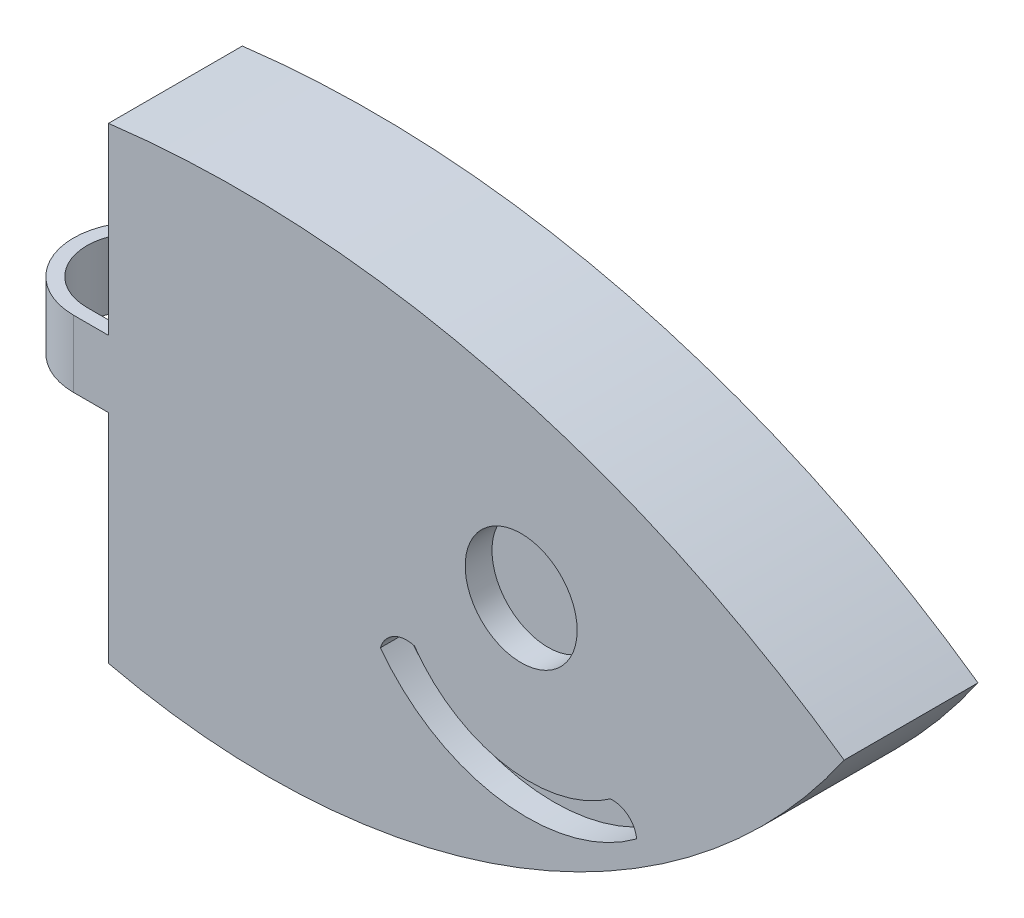
ISO-10303-21;
HEADER;
FILE_DESCRIPTION(('STEP AP214'),'2;1');
FILE_NAME('part.step','',(''),(''),'','','');
FILE_SCHEMA(('AUTOMOTIVE_DESIGN { 1 0 10303 214 1 1 1 1 }'));
ENDSEC;
DATA;
#1=APPLICATION_CONTEXT('core data for automotive mechanical design processes');
#2=APPLICATION_PROTOCOL_DEFINITION('international standard','automotive_design',2000,#1);
#3=PRODUCT_CONTEXT('',#1,'mechanical');
#4=PRODUCT('Part','Part','',(#3));
#5=PRODUCT_RELATED_PRODUCT_CATEGORY('part','',(#4));
#6=PRODUCT_DEFINITION_FORMATION('','',#4);
#7=PRODUCT_DEFINITION_CONTEXT('part definition',#1,'design');
#8=PRODUCT_DEFINITION('design','',#6,#7);
#9=PRODUCT_DEFINITION_SHAPE('','',#8);
#10=(LENGTH_UNIT() NAMED_UNIT(*) SI_UNIT(.MILLI.,.METRE.));
#11=(NAMED_UNIT(*) PLANE_ANGLE_UNIT() SI_UNIT($,.RADIAN.));
#12=(NAMED_UNIT(*) SI_UNIT($,.STERADIAN.) SOLID_ANGLE_UNIT());
#13=UNCERTAINTY_MEASURE_WITH_UNIT(LENGTH_MEASURE(1.E-05),#10,'distance_accuracy_value','');
#14=(GEOMETRIC_REPRESENTATION_CONTEXT(3) GLOBAL_UNCERTAINTY_ASSIGNED_CONTEXT((#13)) GLOBAL_UNIT_ASSIGNED_CONTEXT((#10,
#11,#12)) REPRESENTATION_CONTEXT('',''));
#15=CARTESIAN_POINT('',(0.,0.,0.));
#16=DIRECTION('',(0.,0.,1.));
#17=DIRECTION('',(1.,0.,0.));
#18=AXIS2_PLACEMENT_3D('',#15,#16,#17);
#19=CARTESIAN_POINT('',(-43.0700554600255,29.7516169908367,10.));
#20=DIRECTION('',(0.,0.,-1.));
#21=DIRECTION('',(-1.,0.,0.));
#22=AXIS2_PLACEMENT_3D('',#19,#20,#21);
#23=CYLINDRICAL_SURFACE('',#22,52.3468087938426);
#24=CARTESIAN_POINT('',(-43.0700554600255,29.7516169908367,0.));
#25=DIRECTION('',(0.,0.,-1.));
#26=DIRECTION('',(-1.,0.,0.));
#27=AXIS2_PLACEMENT_3D('',#24,#25,#26);
#28=CIRCLE('',#27,52.3468087938426);
#29=CARTESIAN_POINT('',(0.,0.,0.));
#30=VERTEX_POINT('',#29);
#31=CARTESIAN_POINT('',(-54.9695237739627,-21.2247603298863,0.));
#32=VERTEX_POINT('',#31);
#33=EDGE_CURVE('E233',#30,#32,#28,.T.);
#34=ORIENTED_EDGE('',*,*,#33,.F.);
#35=DIRECTION('',(0.,0.,-1.));
#36=VECTOR('',#35,1.);
#37=CARTESIAN_POINT('',(0.,0.,10.));
#38=LINE('',#37,#36);
#39=CARTESIAN_POINT('',(0.,0.,10.));
#40=VERTEX_POINT('',#39);
#41=EDGE_CURVE('E11',#40,#30,#38,.T.);
#42=ORIENTED_EDGE('',*,*,#41,.F.);
#43=CARTESIAN_POINT('',(-43.0700554600255,29.7516169908367,10.));
#44=DIRECTION('',(0.,0.,-1.));
#45=DIRECTION('',(-1.,0.,0.));
#46=AXIS2_PLACEMENT_3D('',#43,#44,#45);
#47=CIRCLE('',#46,52.3468087938426);
#48=CARTESIAN_POINT('',(-54.9695237739627,-21.2247603298863,10.));
#49=VERTEX_POINT('',#48);
#50=EDGE_CURVE('E236',#40,#49,#47,.T.);
#51=ORIENTED_EDGE('',*,*,#50,.T.);
#52=DIRECTION('',(0.,0.,-1.));
#53=VECTOR('',#52,1.);
#54=CARTESIAN_POINT('',(-54.9695237739627,-21.2247603298863,10.));
#55=LINE('',#54,#53);
#56=EDGE_CURVE('E36',#49,#32,#55,.T.);
#57=ORIENTED_EDGE('',*,*,#56,.T.);
#58=EDGE_LOOP('',(#34,#42,#51,#57));
#59=FACE_BOUND('',#58,.T.);
#60=ADVANCED_FACE('F33',(#59),#23,.T.);
#61=CARTESIAN_POINT('',(-45.2089541250586,-64.1570790860686,10.));
#62=DIRECTION('',(0.,0.,-1.));
#63=DIRECTION('',(-1.,0.,0.));
#64=AXIS2_PLACEMENT_3D('',#61,#62,#63);
#65=CYLINDRICAL_SURFACE('',#64,78.4855421713943);
#66=CARTESIAN_POINT('',(-45.2089541250586,-64.1570790860686,0.));
#67=DIRECTION('',(0.,0.,1.));
#68=DIRECTION('',(1.,0.,0.));
#69=AXIS2_PLACEMENT_3D('',#66,#67,#68);
#70=CIRCLE('',#69,78.4855421713943);
#71=CARTESIAN_POINT('',(-54.9695237739627,13.719179234851,0.));
#72=VERTEX_POINT('',#71);
#73=EDGE_CURVE('E240',#30,#72,#70,.T.);
#74=ORIENTED_EDGE('',*,*,#73,.T.);
#75=DIRECTION('',(0.,0.,-1.));
#76=VECTOR('',#75,1.);
#77=CARTESIAN_POINT('',(-54.9695237739627,13.719179234851,10.));
#78=LINE('',#77,#76);
#79=CARTESIAN_POINT('',(-54.9695237739627,13.719179234851,10.));
#80=VERTEX_POINT('',#79);
#81=EDGE_CURVE('E41',#80,#72,#78,.T.);
#82=ORIENTED_EDGE('',*,*,#81,.F.);
#83=CARTESIAN_POINT('',(-45.2089541250586,-64.1570790860686,10.));
#84=DIRECTION('',(0.,0.,1.));
#85=DIRECTION('',(1.,0.,0.));
#86=AXIS2_PLACEMENT_3D('',#83,#84,#85);
#87=CIRCLE('',#86,78.4855421713943);
#88=EDGE_CURVE('E244',#40,#80,#87,.T.);
#89=ORIENTED_EDGE('',*,*,#88,.F.);
#90=ORIENTED_EDGE('',*,*,#41,.T.);
#91=EDGE_LOOP('',(#74,#82,#89,#90));
#92=FACE_BOUND('',#91,.T.);
#93=ADVANCED_FACE('F268',(#92),#65,.T.);
#94=CARTESIAN_POINT('',(-54.9695237739627,13.719179234851,10.));
#95=DIRECTION('',(1.,0.,0.));
#96=DIRECTION('',(0.,0.,-1.));
#97=AXIS2_PLACEMENT_3D('',#94,#95,#96);
#98=PLANE('',#97);
#99=DIRECTION('',(0.,-1.,0.));
#100=VECTOR('',#99,1.);
#101=CARTESIAN_POINT('',(-54.9695237739627,13.719179234851,0.));
#102=LINE('',#101,#100);
#103=CARTESIAN_POINT('',(-54.9695237739627,0.,0.));
#104=VERTEX_POINT('',#103);
#105=EDGE_CURVE('E249',#72,#104,#102,.T.);
#106=ORIENTED_EDGE('',*,*,#105,.T.);
#107=DIRECTION('',(0.,0.,1.));
#108=VECTOR('',#107,1.);
#109=CARTESIAN_POINT('',(-54.9695237739627,0.,0.));
#110=LINE('',#109,#108);
#111=CARTESIAN_POINT('',(-54.9695237739627,0.,1.));
#112=VERTEX_POINT('',#111);
#113=EDGE_CURVE('E175',#104,#112,#110,.T.);
#114=ORIENTED_EDGE('',*,*,#113,.T.);
#115=DIRECTION('',(0.,1.,0.));
#116=VECTOR('',#115,1.);
#117=CARTESIAN_POINT('',(-54.9695237739627,-5.,1.));
#118=LINE('',#117,#116);
#119=CARTESIAN_POINT('',(-54.9695237739627,-5.,1.));
#120=VERTEX_POINT('',#119);
#121=EDGE_CURVE('E165',#120,#112,#118,.T.);
#122=ORIENTED_EDGE('',*,*,#121,.F.);
#123=DIRECTION('',(0.,0.,1.));
#124=VECTOR('',#123,1.);
#125=CARTESIAN_POINT('',(-54.9695237739627,-5.,0.));
#126=LINE('',#125,#124);
#127=CARTESIAN_POINT('',(-54.9695237739627,-5.,0.));
#128=VERTEX_POINT('',#127);
#129=EDGE_CURVE('E155',#128,#120,#126,.T.);
#130=ORIENTED_EDGE('',*,*,#129,.F.);
#131=EDGE_CURVE('E248',#128,#32,#102,.T.);
#132=ORIENTED_EDGE('',*,*,#131,.T.);
#133=ORIENTED_EDGE('',*,*,#56,.F.);
#134=DIRECTION('',(0.,-1.,0.));
#135=VECTOR('',#134,1.);
#136=CARTESIAN_POINT('',(-54.9695237739627,13.719179234851,10.));
#137=LINE('',#136,#135);
#138=CARTESIAN_POINT('',(-54.9695237739627,-5.,10.));
#139=VERTEX_POINT('',#138);
#140=EDGE_CURVE('E239',#139,#49,#137,.T.);
#141=ORIENTED_EDGE('',*,*,#140,.F.);
#142=CARTESIAN_POINT('',(-54.9695237739627,-5.,9.));
#143=VERTEX_POINT('',#142);
#144=EDGE_CURVE('E180',#143,#139,#126,.T.);
#145=ORIENTED_EDGE('',*,*,#144,.F.);
#146=DIRECTION('',(0.,1.,0.));
#147=VECTOR('',#146,1.);
#148=CARTESIAN_POINT('',(-54.9695237739627,-5.,9.));
#149=LINE('',#148,#147);
#150=CARTESIAN_POINT('',(-54.9695237739627,0.,9.));
#151=VERTEX_POINT('',#150);
#152=EDGE_CURVE('E168',#143,#151,#149,.T.);
#153=ORIENTED_EDGE('',*,*,#152,.T.);
#154=CARTESIAN_POINT('',(-54.9695237739627,0.,10.));
#155=VERTEX_POINT('',#154);
#156=EDGE_CURVE('E191',#151,#155,#110,.T.);
#157=ORIENTED_EDGE('',*,*,#156,.T.);
#158=EDGE_CURVE('E241',#80,#155,#137,.T.);
#159=ORIENTED_EDGE('',*,*,#158,.F.);
#160=ORIENTED_EDGE('',*,*,#81,.T.);
#161=EDGE_LOOP('',(#106,#114,#122,#130,#132,#133,#141,#145,#153,#157,#159,#160));
#162=FACE_BOUND('',#161,.T.);
#163=ADVANCED_FACE('F275',(#162),#98,.F.);
#164=CARTESIAN_POINT('',(-43.0700554600255,29.7516169908367,10.));
#165=DIRECTION('',(0.,0.,-1.));
#166=DIRECTION('',(-1.,0.,0.));
#167=AXIS2_PLACEMENT_3D('',#164,#165,#166);
#168=PLANE('',#167);
#169=CARTESIAN_POINT('',(-23.6817754696833,-1.88257582384283,10.));
#170=DIRECTION('',(0.,0.,1.));
#171=DIRECTION('',(1.,0.,0.));
#172=AXIS2_PLACEMENT_3D('',#169,#170,#171);
#173=CIRCLE('',#172,13.6826289805947);
#174=CARTESIAN_POINT('',(-34.6529569618216,-10.0586086324349,10.));
#175=VERTEX_POINT('',#174);
#176=CARTESIAN_POINT('',(-15.5057426610913,-12.8537573159811,10.));
#177=VERTEX_POINT('',#176);
#178=EDGE_CURVE('E213',#175,#177,#173,.T.);
#179=ORIENTED_EDGE('',*,*,#178,.F.);
#180=CARTESIAN_POINT('',(-32.6856617930463,-10.6288960818269,10.));
#181=DIRECTION('',(0.,0.,1.));
#182=DIRECTION('',(1.,0.,0.));
#183=AXIS2_PLACEMENT_3D('',#180,#181,#182);
#184=CIRCLE('',#183,2.04828661471497);
#185=CARTESIAN_POINT('',(-32.1153743436543,-8.66160091305167,10.));
#186=VERTEX_POINT('',#185);
#187=EDGE_CURVE('E196',#186,#175,#184,.T.);
#188=ORIENTED_EDGE('',*,*,#187,.F.);
#189=CARTESIAN_POINT('',(-23.4982210788747,-2.62998179113159,10.));
#190=DIRECTION('',(0.,0.,-1.));
#191=DIRECTION('',(1.,0.,0.));
#192=AXIS2_PLACEMENT_3D('',#189,#190,#191);
#193=CIRCLE('',#192,10.5183534652822);
#194=CARTESIAN_POINT('',(-17.4666019569546,-11.2471350559112,10.));
#195=VERTEX_POINT('',#194);
#196=EDGE_CURVE('E202',#195,#186,#193,.T.);
#197=ORIENTED_EDGE('',*,*,#196,.F.);
#198=CARTESIAN_POINT('',(-17.2894834390579,-13.0308758338779,10.));
#199=DIRECTION('',(0.,0.,1.));
#200=DIRECTION('',(-1.,0.,0.));
#201=AXIS2_PLACEMENT_3D('',#198,#199,#200);
#202=CIRCLE('',#201,1.79251279838193);
#203=EDGE_CURVE('E216',#177,#195,#202,.T.);
#204=ORIENTED_EDGE('',*,*,#203,.F.);
#205=EDGE_LOOP('',(#179,#188,#197,#204));
#206=FACE_BOUND('',#205,.T.);
#207=CARTESIAN_POINT('',(-24.1329800534643,-1.58578150291433,10.));
#208=DIRECTION('',(0.,0.,1.));
#209=DIRECTION('',(1.,0.,0.));
#210=AXIS2_PLACEMENT_3D('',#207,#208,#209);
#211=CIRCLE('',#210,4.182683646044);
#212=CARTESIAN_POINT('',(-19.9502964074203,-1.58578150291433,10.));
#213=VERTEX_POINT('',#212);
#214=EDGE_CURVE('E223',#213,#213,#211,.T.);
#215=ORIENTED_EDGE('',*,*,#214,.F.);
#216=EDGE_LOOP('',(#215));
#217=FACE_BOUND('',#216,.T.);
#218=ORIENTED_EDGE('',*,*,#50,.F.);
#219=ORIENTED_EDGE('',*,*,#88,.T.);
#220=ORIENTED_EDGE('',*,*,#158,.T.);
#221=DIRECTION('',(-1.,0.,0.));
#222=VECTOR('',#221,1.);
#223=CARTESIAN_POINT('',(-54.9695237739627,0.,10.));
#224=LINE('',#223,#222);
#225=CARTESIAN_POINT('',(-57.5781838189962,0.,10.));
#226=VERTEX_POINT('',#225);
#227=EDGE_CURVE('E188',#155,#226,#224,.T.);
#228=ORIENTED_EDGE('',*,*,#227,.T.);
#229=DIRECTION('',(0.,1.,0.));
#230=VECTOR('',#229,1.);
#231=CARTESIAN_POINT('',(-57.5781838189962,-5.,10.));
#232=LINE('',#231,#230);
#233=CARTESIAN_POINT('',(-57.5781838189962,-5.,10.));
#234=VERTEX_POINT('',#233);
#235=EDGE_CURVE('E194',#234,#226,#232,.T.);
#236=ORIENTED_EDGE('',*,*,#235,.F.);
#237=DIRECTION('',(-1.,0.,0.));
#238=VECTOR('',#237,1.);
#239=CARTESIAN_POINT('',(-54.9695237739627,-5.,10.));
#240=LINE('',#239,#238);
#241=EDGE_CURVE('E178',#139,#234,#240,.T.);
#242=ORIENTED_EDGE('',*,*,#241,.F.);
#243=ORIENTED_EDGE('',*,*,#140,.T.);
#244=EDGE_LOOP('',(#218,#219,#220,#228,#236,#242,#243));
#245=FACE_BOUND('',#244,.T.);
#246=ADVANCED_FACE('F271',(#206,#217,#245),#168,.F.);
#247=CARTESIAN_POINT('',(-43.0700554600255,29.7516169908367,0.));
#248=DIRECTION('',(0.,0.,-1.));
#249=DIRECTION('',(-1.,0.,0.));
#250=AXIS2_PLACEMENT_3D('',#247,#248,#249);
#251=PLANE('',#250);
#252=ORIENTED_EDGE('',*,*,#33,.T.);
#253=ORIENTED_EDGE('',*,*,#131,.F.);
#254=DIRECTION('',(-1.,0.,0.));
#255=VECTOR('',#254,1.);
#256=CARTESIAN_POINT('',(-54.9695237739627,-5.,0.));
#257=LINE('',#256,#255);
#258=CARTESIAN_POINT('',(-57.5781838189962,-5.,0.));
#259=VERTEX_POINT('',#258);
#260=EDGE_CURVE('E171',#128,#259,#257,.T.);
#261=ORIENTED_EDGE('',*,*,#260,.T.);
#262=DIRECTION('',(0.,1.,0.));
#263=VECTOR('',#262,1.);
#264=CARTESIAN_POINT('',(-57.5781838189962,-5.,0.));
#265=LINE('',#264,#263);
#266=CARTESIAN_POINT('',(-57.5781838189962,0.,0.));
#267=VERTEX_POINT('',#266);
#268=EDGE_CURVE('E182',#259,#267,#265,.T.);
#269=ORIENTED_EDGE('',*,*,#268,.T.);
#270=DIRECTION('',(-1.,0.,0.));
#271=VECTOR('',#270,1.);
#272=CARTESIAN_POINT('',(-54.9695237739627,0.,0.));
#273=LINE('',#272,#271);
#274=EDGE_CURVE('E167',#104,#267,#273,.T.);
#275=ORIENTED_EDGE('',*,*,#274,.F.);
#276=ORIENTED_EDGE('',*,*,#105,.F.);
#277=ORIENTED_EDGE('',*,*,#73,.F.);
#278=EDGE_LOOP('',(#252,#253,#261,#269,#275,#276,#277));
#279=FACE_BOUND('',#278,.T.);
#280=ADVANCED_FACE('F265',(#279),#251,.T.);
#281=CARTESIAN_POINT('',(-24.1329800534643,-1.58578150291433,8.));
#282=DIRECTION('',(0.,0.,1.));
#283=DIRECTION('',(1.,0.,0.));
#284=AXIS2_PLACEMENT_3D('',#281,#282,#283);
#285=CYLINDRICAL_SURFACE('',#284,4.182683646044);
#286=CARTESIAN_POINT('',(-24.1329800534643,-1.58578150291433,8.));
#287=DIRECTION('',(0.,0.,1.));
#288=DIRECTION('',(1.,0.,0.));
#289=AXIS2_PLACEMENT_3D('',#286,#287,#288);
#290=CIRCLE('',#289,4.182683646044);
#291=CARTESIAN_POINT('',(-19.9502964074203,-1.58578150291433,8.));
#292=VERTEX_POINT('',#291);
#293=EDGE_CURVE('E230',#292,#292,#290,.T.);
#294=ORIENTED_EDGE('',*,*,#293,.F.);
#295=EDGE_LOOP('',(#294));
#296=FACE_BOUND('',#295,.T.);
#297=ORIENTED_EDGE('',*,*,#214,.T.);
#298=EDGE_LOOP('',(#297));
#299=FACE_BOUND('',#298,.T.);
#300=ADVANCED_FACE('F311',(#296,#299),#285,.F.);
#301=CARTESIAN_POINT('',(-24.1329800534643,-1.58578150291433,8.));
#302=DIRECTION('',(0.,0.,1.));
#303=DIRECTION('',(1.,0.,0.));
#304=AXIS2_PLACEMENT_3D('',#301,#302,#303);
#305=PLANE('',#304);
#306=ORIENTED_EDGE('',*,*,#293,.T.);
#307=EDGE_LOOP('',(#306));
#308=FACE_BOUND('',#307,.T.);
#309=ADVANCED_FACE('F317',(#308),#305,.T.);
#310=CARTESIAN_POINT('',(-32.6856617930463,-10.6288960818269,8.));
#311=DIRECTION('',(0.,0.,1.));
#312=DIRECTION('',(1.,0.,0.));
#313=AXIS2_PLACEMENT_3D('',#310,#311,#312);
#314=CYLINDRICAL_SURFACE('',#313,2.04828661471497);
#315=ORIENTED_EDGE('',*,*,#187,.T.);
#316=DIRECTION('',(0.,0.,1.));
#317=VECTOR('',#316,1.);
#318=CARTESIAN_POINT('',(-34.6529569618216,-10.0586086324349,8.));
#319=LINE('',#318,#317);
#320=CARTESIAN_POINT('',(-34.6529569618216,-10.0586086324349,8.));
#321=VERTEX_POINT('',#320);
#322=EDGE_CURVE('E211',#321,#175,#319,.T.);
#323=ORIENTED_EDGE('',*,*,#322,.F.);
#324=CARTESIAN_POINT('',(-32.6856617930463,-10.6288960818269,8.));
#325=DIRECTION('',(0.,0.,1.));
#326=DIRECTION('',(1.,0.,0.));
#327=AXIS2_PLACEMENT_3D('',#324,#325,#326);
#328=CIRCLE('',#327,2.04828661471497);
#329=CARTESIAN_POINT('',(-32.1153743436543,-8.66160091305167,8.));
#330=VERTEX_POINT('',#329);
#331=EDGE_CURVE('E198',#330,#321,#328,.T.);
#332=ORIENTED_EDGE('',*,*,#331,.F.);
#333=DIRECTION('',(0.,0.,1.));
#334=VECTOR('',#333,1.);
#335=CARTESIAN_POINT('',(-32.1153743436543,-8.66160091305167,8.));
#336=LINE('',#335,#334);
#337=EDGE_CURVE('E221',#330,#186,#336,.T.);
#338=ORIENTED_EDGE('',*,*,#337,.T.);
#339=EDGE_LOOP('',(#315,#323,#332,#338));
#340=FACE_BOUND('',#339,.T.);
#341=ADVANCED_FACE('F321',(#340),#314,.F.);
#342=CARTESIAN_POINT('',(-23.4982210788747,-2.62998179113159,8.));
#343=DIRECTION('',(0.,0.,1.));
#344=DIRECTION('',(1.,0.,0.));
#345=AXIS2_PLACEMENT_3D('',#342,#343,#344);
#346=CYLINDRICAL_SURFACE('',#345,10.5183534652822);
#347=ORIENTED_EDGE('',*,*,#196,.T.);
#348=ORIENTED_EDGE('',*,*,#337,.F.);
#349=CARTESIAN_POINT('',(-23.4982210788747,-2.62998179113159,8.));
#350=DIRECTION('',(0.,0.,-1.));
#351=DIRECTION('',(1.,0.,0.));
#352=AXIS2_PLACEMENT_3D('',#349,#350,#351);
#353=CIRCLE('',#352,10.5183534652822);
#354=CARTESIAN_POINT('',(-17.4666019569546,-11.2471350559112,8.));
#355=VERTEX_POINT('',#354);
#356=EDGE_CURVE('E208',#355,#330,#353,.T.);
#357=ORIENTED_EDGE('',*,*,#356,.F.);
#358=DIRECTION('',(0.,0.,1.));
#359=VECTOR('',#358,1.);
#360=CARTESIAN_POINT('',(-17.4666019569546,-11.2471350559112,8.));
#361=LINE('',#360,#359);
#362=EDGE_CURVE('E224',#355,#195,#361,.T.);
#363=ORIENTED_EDGE('',*,*,#362,.T.);
#364=EDGE_LOOP('',(#347,#348,#357,#363));
#365=FACE_BOUND('',#364,.T.);
#366=ADVANCED_FACE('F325',(#365),#346,.T.);
#367=CARTESIAN_POINT('',(-17.2894834390579,-13.0308758338779,8.));
#368=DIRECTION('',(0.,0.,1.));
#369=DIRECTION('',(1.,0.,0.));
#370=AXIS2_PLACEMENT_3D('',#367,#368,#369);
#371=CYLINDRICAL_SURFACE('',#370,1.79251279838193);
#372=ORIENTED_EDGE('',*,*,#203,.T.);
#373=ORIENTED_EDGE('',*,*,#362,.F.);
#374=CARTESIAN_POINT('',(-17.2894834390579,-13.0308758338779,8.));
#375=DIRECTION('',(0.,0.,1.));
#376=DIRECTION('',(-1.,0.,0.));
#377=AXIS2_PLACEMENT_3D('',#374,#375,#376);
#378=CIRCLE('',#377,1.79251279838193);
#379=CARTESIAN_POINT('',(-15.5057426610913,-12.8537573159811,8.));
#380=VERTEX_POINT('',#379);
#381=EDGE_CURVE('E205',#380,#355,#378,.T.);
#382=ORIENTED_EDGE('',*,*,#381,.F.);
#383=DIRECTION('',(0.,0.,1.));
#384=VECTOR('',#383,1.);
#385=CARTESIAN_POINT('',(-15.5057426610913,-12.8537573159811,8.));
#386=LINE('',#385,#384);
#387=EDGE_CURVE('E226',#380,#177,#386,.T.);
#388=ORIENTED_EDGE('',*,*,#387,.T.);
#389=EDGE_LOOP('',(#372,#373,#382,#388));
#390=FACE_BOUND('',#389,.T.);
#391=ADVANCED_FACE('F329',(#390),#371,.F.);
#392=CARTESIAN_POINT('',(-23.6817754696833,-1.88257582384283,8.));
#393=DIRECTION('',(0.,0.,1.));
#394=DIRECTION('',(1.,0.,0.));
#395=AXIS2_PLACEMENT_3D('',#392,#393,#394);
#396=CYLINDRICAL_SURFACE('',#395,13.6826289805947);
#397=ORIENTED_EDGE('',*,*,#178,.T.);
#398=ORIENTED_EDGE('',*,*,#387,.F.);
#399=CARTESIAN_POINT('',(-23.6817754696833,-1.88257582384283,8.));
#400=DIRECTION('',(0.,0.,1.));
#401=DIRECTION('',(1.,0.,0.));
#402=AXIS2_PLACEMENT_3D('',#399,#400,#401);
#403=CIRCLE('',#402,13.6826289805947);
#404=EDGE_CURVE('E201',#321,#380,#403,.T.);
#405=ORIENTED_EDGE('',*,*,#404,.F.);
#406=ORIENTED_EDGE('',*,*,#322,.T.);
#407=EDGE_LOOP('',(#397,#398,#405,#406));
#408=FACE_BOUND('',#407,.T.);
#409=ADVANCED_FACE('F296',(#408),#396,.F.);
#410=CARTESIAN_POINT('',(-28.1837186313648,-6.25573595283488,8.));
#411=DIRECTION('',(0.,0.,1.));
#412=DIRECTION('',(1.,0.,0.));
#413=AXIS2_PLACEMENT_3D('',#410,#411,#412);
#414=PLANE('',#413);
#415=ORIENTED_EDGE('',*,*,#331,.T.);
#416=ORIENTED_EDGE('',*,*,#404,.T.);
#417=ORIENTED_EDGE('',*,*,#381,.T.);
#418=ORIENTED_EDGE('',*,*,#356,.T.);
#419=EDGE_LOOP('',(#415,#416,#417,#418));
#420=FACE_BOUND('',#419,.T.);
#421=ADVANCED_FACE('F289',(#420),#414,.T.);
#422=CARTESIAN_POINT('',(-57.5781838189962,-5.,5.));
#423=DIRECTION('',(0.,1.,0.));
#424=DIRECTION('',(0.,0.,1.));
#425=AXIS2_PLACEMENT_3D('',#422,#423,#424);
#426=CYLINDRICAL_SURFACE('',#425,5.);
#427=CARTESIAN_POINT('',(-57.5781838189962,0.,5.));
#428=DIRECTION('',(0.,1.,0.));
#429=DIRECTION('',(0.,0.,1.));
#430=AXIS2_PLACEMENT_3D('',#427,#428,#429);
#431=CIRCLE('',#430,5.);
#432=EDGE_CURVE('E185',#267,#226,#431,.T.);
#433=ORIENTED_EDGE('',*,*,#432,.F.);
#434=ORIENTED_EDGE('',*,*,#268,.F.);
#435=CARTESIAN_POINT('',(-57.5781838189962,-5.,5.));
#436=DIRECTION('',(0.,1.,0.));
#437=DIRECTION('',(0.,0.,1.));
#438=AXIS2_PLACEMENT_3D('',#435,#436,#437);
#439=CIRCLE('',#438,5.);
#440=EDGE_CURVE('E174',#259,#234,#439,.T.);
#441=ORIENTED_EDGE('',*,*,#440,.T.);
#442=ORIENTED_EDGE('',*,*,#235,.T.);
#443=EDGE_LOOP('',(#433,#434,#441,#442));
#444=FACE_BOUND('',#443,.T.);
#445=ADVANCED_FACE('F287',(#444),#426,.T.);
#446=CARTESIAN_POINT('',(-57.5781838189962,-5.,5.));
#447=DIRECTION('',(0.,1.,0.));
#448=DIRECTION('',(0.,0.,1.));
#449=AXIS2_PLACEMENT_3D('',#446,#447,#448);
#450=PLANE('',#449);
#451=ORIENTED_EDGE('',*,*,#129,.T.);
#452=DIRECTION('',(-1.,0.,0.));
#453=VECTOR('',#452,1.);
#454=CARTESIAN_POINT('',(-54.9695237739627,-5.,1.));
#455=LINE('',#454,#453);
#456=CARTESIAN_POINT('',(-57.5781838189962,-5.,1.));
#457=VERTEX_POINT('',#456);
#458=EDGE_CURVE('E142',#120,#457,#455,.T.);
#459=ORIENTED_EDGE('',*,*,#458,.T.);
#460=CARTESIAN_POINT('',(-57.5781838189962,-5.,5.));
#461=DIRECTION('',(0.,1.,0.));
#462=DIRECTION('',(0.,0.,1.));
#463=AXIS2_PLACEMENT_3D('',#460,#461,#462);
#464=CIRCLE('',#463,4.);
#465=CARTESIAN_POINT('',(-57.5781838189962,-5.,9.));
#466=VERTEX_POINT('',#465);
#467=EDGE_CURVE('E148',#457,#466,#464,.T.);
#468=ORIENTED_EDGE('',*,*,#467,.T.);
#469=DIRECTION('',(-1.,0.,0.));
#470=VECTOR('',#469,1.);
#471=CARTESIAN_POINT('',(-54.9695237739627,-5.,9.));
#472=LINE('',#471,#470);
#473=EDGE_CURVE('E145',#143,#466,#472,.T.);
#474=ORIENTED_EDGE('',*,*,#473,.F.);
#475=ORIENTED_EDGE('',*,*,#144,.T.);
#476=ORIENTED_EDGE('',*,*,#241,.T.);
#477=ORIENTED_EDGE('',*,*,#440,.F.);
#478=ORIENTED_EDGE('',*,*,#260,.F.);
#479=EDGE_LOOP('',(#451,#459,#468,#474,#475,#476,#477,#478));
#480=FACE_BOUND('',#479,.T.);
#481=ADVANCED_FACE('F153',(#480),#450,.F.);
#482=CARTESIAN_POINT('',(-57.5781838189962,0.,5.));
#483=DIRECTION('',(0.,1.,0.));
#484=DIRECTION('',(0.,0.,1.));
#485=AXIS2_PLACEMENT_3D('',#482,#483,#484);
#486=PLANE('',#485);
#487=DIRECTION('',(-1.,0.,0.));
#488=VECTOR('',#487,1.);
#489=CARTESIAN_POINT('',(-54.9695237739627,0.,1.));
#490=LINE('',#489,#488);
#491=CARTESIAN_POINT('',(-57.5781838189962,0.,1.));
#492=VERTEX_POINT('',#491);
#493=EDGE_CURVE('E57',#112,#492,#490,.T.);
#494=ORIENTED_EDGE('',*,*,#493,.F.);
#495=ORIENTED_EDGE('',*,*,#113,.F.);
#496=ORIENTED_EDGE('',*,*,#274,.T.);
#497=ORIENTED_EDGE('',*,*,#432,.T.);
#498=ORIENTED_EDGE('',*,*,#227,.F.);
#499=ORIENTED_EDGE('',*,*,#156,.F.);
#500=DIRECTION('',(-1.,0.,0.));
#501=VECTOR('',#500,1.);
#502=CARTESIAN_POINT('',(-54.9695237739627,0.,9.));
#503=LINE('',#502,#501);
#504=CARTESIAN_POINT('',(-57.5781838189962,0.,9.));
#505=VERTEX_POINT('',#504);
#506=EDGE_CURVE('E156',#151,#505,#503,.T.);
#507=ORIENTED_EDGE('',*,*,#506,.T.);
#508=CARTESIAN_POINT('',(-57.5781838189962,0.,5.));
#509=DIRECTION('',(0.,1.,0.));
#510=DIRECTION('',(0.,0.,1.));
#511=AXIS2_PLACEMENT_3D('',#508,#509,#510);
#512=CIRCLE('',#511,4.);
#513=EDGE_CURVE('E159',#492,#505,#512,.T.);
#514=ORIENTED_EDGE('',*,*,#513,.F.);
#515=EDGE_LOOP('',(#494,#495,#496,#497,#498,#499,#507,#514));
#516=FACE_BOUND('',#515,.T.);
#517=ADVANCED_FACE('F283',(#516),#486,.T.);
#518=CARTESIAN_POINT('',(-54.9695237739627,-5.,1.));
#519=DIRECTION('',(0.,0.,-1.));
#520=DIRECTION('',(-1.,0.,0.));
#521=AXIS2_PLACEMENT_3D('',#518,#519,#520);
#522=PLANE('',#521);
#523=ORIENTED_EDGE('',*,*,#493,.T.);
#524=DIRECTION('',(0.,1.,0.));
#525=VECTOR('',#524,1.);
#526=CARTESIAN_POINT('',(-57.5781838189962,-5.,1.));
#527=LINE('',#526,#525);
#528=EDGE_CURVE('E139',#457,#492,#527,.T.);
#529=ORIENTED_EDGE('',*,*,#528,.F.);
#530=ORIENTED_EDGE('',*,*,#458,.F.);
#531=ORIENTED_EDGE('',*,*,#121,.T.);
#532=EDGE_LOOP('',(#523,#529,#530,#531));
#533=FACE_BOUND('',#532,.T.);
#534=ADVANCED_FACE('F140',(#533),#522,.F.);
#535=CARTESIAN_POINT('',(-54.9695237739627,-5.,9.));
#536=DIRECTION('',(0.,0.,-1.));
#537=DIRECTION('',(-1.,0.,0.));
#538=AXIS2_PLACEMENT_3D('',#535,#536,#537);
#539=PLANE('',#538);
#540=ORIENTED_EDGE('',*,*,#506,.F.);
#541=ORIENTED_EDGE('',*,*,#152,.F.);
#542=ORIENTED_EDGE('',*,*,#473,.T.);
#543=DIRECTION('',(0.,1.,0.));
#544=VECTOR('',#543,1.);
#545=CARTESIAN_POINT('',(-57.5781838189962,-5.,9.));
#546=LINE('',#545,#544);
#547=EDGE_CURVE('E49',#466,#505,#546,.T.);
#548=ORIENTED_EDGE('',*,*,#547,.T.);
#549=EDGE_LOOP('',(#540,#541,#542,#548));
#550=FACE_BOUND('',#549,.T.);
#551=ADVANCED_FACE('F279',(#550),#539,.T.);
#552=CARTESIAN_POINT('',(-57.5781838189962,-5.,5.));
#553=DIRECTION('',(0.,1.,0.));
#554=DIRECTION('',(0.,0.,1.));
#555=AXIS2_PLACEMENT_3D('',#552,#553,#554);
#556=CYLINDRICAL_SURFACE('',#555,4.);
#557=ORIENTED_EDGE('',*,*,#513,.T.);
#558=ORIENTED_EDGE('',*,*,#547,.F.);
#559=ORIENTED_EDGE('',*,*,#467,.F.);
#560=ORIENTED_EDGE('',*,*,#528,.T.);
#561=EDGE_LOOP('',(#557,#558,#559,#560));
#562=FACE_BOUND('',#561,.T.);
#563=ADVANCED_FACE('F149',(#562),#556,.F.);
#564=CLOSED_SHELL('',(#60,#93,#163,#246,#280,#300,#309,#341,#366,#391,#409,#421,#445,#481,#517,
#534,#551,#563));
#565=MANIFOLD_SOLID_BREP('B2',#564);
#566=ADVANCED_BREP_SHAPE_REPRESENTATION('',(#18,#565),#14);
#567=SHAPE_DEFINITION_REPRESENTATION(#9,#566);
ENDSEC;
END-ISO-10303-21;
